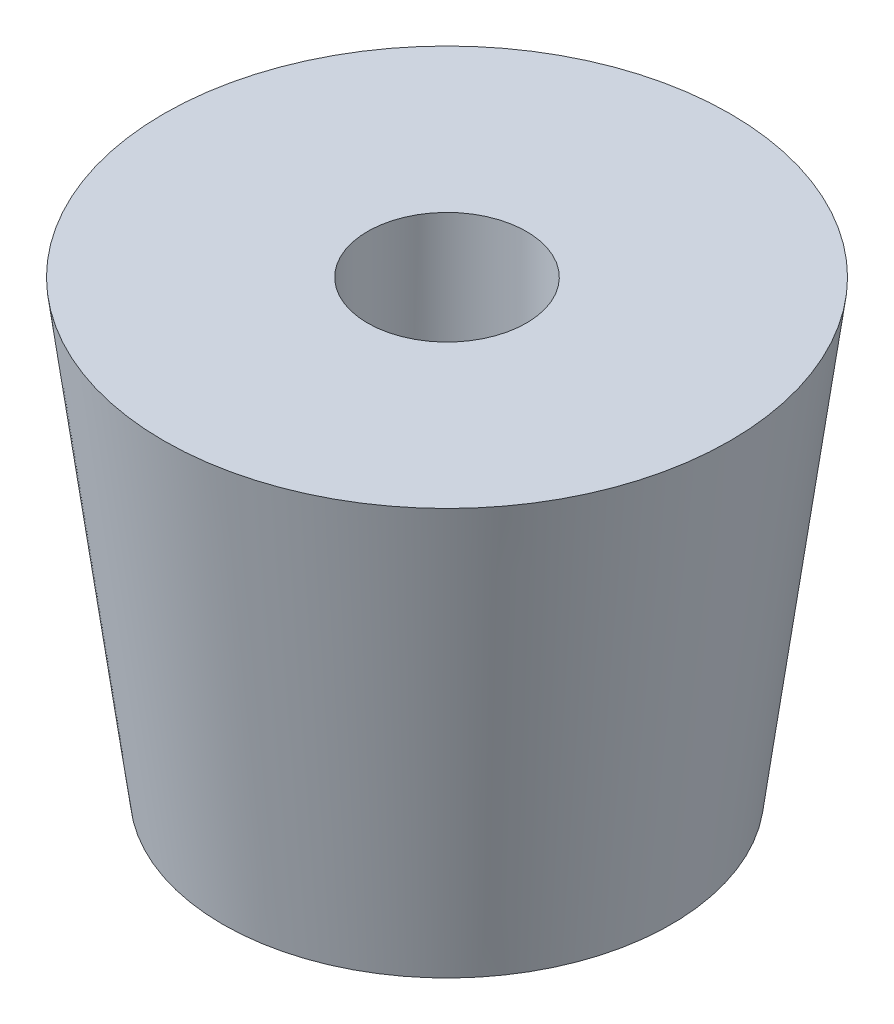
ISO-10303-21;
HEADER;
FILE_DESCRIPTION(('STEP AP214'),'2;1');
FILE_NAME('part.step','',(''),(''),'','','');
FILE_SCHEMA(('AUTOMOTIVE_DESIGN { 1 0 10303 214 1 1 1 1 }'));
ENDSEC;
DATA;
#1=APPLICATION_CONTEXT('core data for automotive mechanical design processes');
#2=APPLICATION_PROTOCOL_DEFINITION('international standard','automotive_design',2000,#1);
#3=PRODUCT_CONTEXT('',#1,'mechanical');
#4=PRODUCT('Part','Part','',(#3));
#5=PRODUCT_RELATED_PRODUCT_CATEGORY('part','',(#4));
#6=PRODUCT_DEFINITION_FORMATION('','',#4);
#7=PRODUCT_DEFINITION_CONTEXT('part definition',#1,'design');
#8=PRODUCT_DEFINITION('design','',#6,#7);
#9=PRODUCT_DEFINITION_SHAPE('','',#8);
#10=(LENGTH_UNIT() NAMED_UNIT(*) SI_UNIT(.MILLI.,.METRE.));
#11=(NAMED_UNIT(*) PLANE_ANGLE_UNIT() SI_UNIT($,.RADIAN.));
#12=(NAMED_UNIT(*) SI_UNIT($,.STERADIAN.) SOLID_ANGLE_UNIT());
#13=UNCERTAINTY_MEASURE_WITH_UNIT(LENGTH_MEASURE(1.E-05),#10,'distance_accuracy_value','');
#14=(GEOMETRIC_REPRESENTATION_CONTEXT(3) GLOBAL_UNCERTAINTY_ASSIGNED_CONTEXT((#13)) GLOBAL_UNIT_ASSIGNED_CONTEXT((#10,
#11,#12)) REPRESENTATION_CONTEXT('',''));
#15=CARTESIAN_POINT('',(0.,0.,0.));
#16=DIRECTION('',(0.,0.,1.));
#17=DIRECTION('',(1.,0.,0.));
#18=AXIS2_PLACEMENT_3D('',#15,#16,#17);
#19=CARTESIAN_POINT('',(0.,0.,0.));
#20=DIRECTION('',(0.,1.,0.));
#21=DIRECTION('',(0.,0.,1.));
#22=AXIS2_PLACEMENT_3D('',#19,#20,#21);
#23=CONICAL_SURFACE('',#22,6.35,0.130899693899575);
#24=CARTESIAN_POINT('',(0.,12.7,0.));
#25=DIRECTION('',(0.,1.,0.));
#26=DIRECTION('',(0.,0.,1.));
#27=AXIS2_PLACEMENT_3D('',#24,#25,#26);
#28=CIRCLE('',#27,8.02198671935993);
#29=CARTESIAN_POINT('',(0.,12.7,8.02198671935993));
#30=VERTEX_POINT('',#29);
#31=EDGE_CURVE('E10',#30,#30,#28,.T.);
#32=ORIENTED_EDGE('',*,*,#31,.F.);
#33=EDGE_LOOP('',(#32));
#34=FACE_BOUND('',#33,.T.);
#35=CARTESIAN_POINT('',(0.,0.,0.));
#36=DIRECTION('',(0.,1.,0.));
#37=DIRECTION('',(0.,0.,1.));
#38=AXIS2_PLACEMENT_3D('',#35,#36,#37);
#39=CIRCLE('',#38,6.35);
#40=CARTESIAN_POINT('',(0.,0.,6.35));
#41=VERTEX_POINT('',#40);
#42=EDGE_CURVE('E45',#41,#41,#39,.T.);
#43=ORIENTED_EDGE('',*,*,#42,.T.);
#44=EDGE_LOOP('',(#43));
#45=FACE_BOUND('',#44,.T.);
#46=ADVANCED_FACE('F37',(#34,#45),#23,.T.);
#47=CARTESIAN_POINT('',(0.,12.7,0.));
#48=DIRECTION('',(0.,1.,0.));
#49=DIRECTION('',(0.,0.,1.));
#50=AXIS2_PLACEMENT_3D('',#47,#48,#49);
#51=PLANE('',#50);
#52=CARTESIAN_POINT('',(0.,12.7,0.));
#53=DIRECTION('',(0.,1.,0.));
#54=DIRECTION('',(0.,0.,1.));
#55=AXIS2_PLACEMENT_3D('',#52,#53,#54);
#56=CIRCLE('',#55,2.25);
#57=CARTESIAN_POINT('',(0.,12.7,2.25));
#58=VERTEX_POINT('',#57);
#59=EDGE_CURVE('E60',#58,#58,#56,.T.);
#60=ORIENTED_EDGE('',*,*,#59,.F.);
#61=EDGE_LOOP('',(#60));
#62=FACE_BOUND('',#61,.T.);
#63=ORIENTED_EDGE('',*,*,#31,.T.);
#64=EDGE_LOOP('',(#63));
#65=FACE_BOUND('',#64,.T.);
#66=ADVANCED_FACE('F86',(#62,#65),#51,.T.);
#67=CARTESIAN_POINT('',(0.,0.,0.));
#68=DIRECTION('',(0.,1.,0.));
#69=DIRECTION('',(0.,0.,1.));
#70=AXIS2_PLACEMENT_3D('',#67,#68,#69);
#71=PLANE('',#70);
#72=CARTESIAN_POINT('',(0.,0.,0.));
#73=DIRECTION('',(0.,-1.,0.));
#74=DIRECTION('',(0.,0.,-1.));
#75=AXIS2_PLACEMENT_3D('',#72,#73,#74);
#76=CIRCLE('',#75,3.5);
#77=CARTESIAN_POINT('',(0.,0.,-3.5));
#78=VERTEX_POINT('',#77);
#79=EDGE_CURVE('E53',#78,#78,#76,.T.);
#80=ORIENTED_EDGE('',*,*,#79,.F.);
#81=EDGE_LOOP('',(#80));
#82=FACE_BOUND('',#81,.T.);
#83=ORIENTED_EDGE('',*,*,#42,.F.);
#84=EDGE_LOOP('',(#83));
#85=FACE_BOUND('',#84,.T.);
#86=ADVANCED_FACE('F80',(#82,#85),#71,.F.);
#87=CARTESIAN_POINT('',(0.,8.89,0.));
#88=DIRECTION('',(0.,-1.,0.));
#89=DIRECTION('',(0.,0.,-1.));
#90=AXIS2_PLACEMENT_3D('',#87,#88,#89);
#91=CYLINDRICAL_SURFACE('',#90,3.5);
#92=CARTESIAN_POINT('',(0.,8.89,0.));
#93=DIRECTION('',(0.,-1.,0.));
#94=DIRECTION('',(0.,0.,-1.));
#95=AXIS2_PLACEMENT_3D('',#92,#93,#94);
#96=CIRCLE('',#95,3.5);
#97=CARTESIAN_POINT('',(0.,8.89,-3.5));
#98=VERTEX_POINT('',#97);
#99=EDGE_CURVE('E50',#98,#98,#96,.T.);
#100=ORIENTED_EDGE('',*,*,#99,.F.);
#101=EDGE_LOOP('',(#100));
#102=FACE_BOUND('',#101,.T.);
#103=ORIENTED_EDGE('',*,*,#79,.T.);
#104=EDGE_LOOP('',(#103));
#105=FACE_BOUND('',#104,.T.);
#106=ADVANCED_FACE('F74',(#102,#105),#91,.F.);
#107=CARTESIAN_POINT('',(0.,8.89,0.));
#108=DIRECTION('',(0.,-1.,0.));
#109=DIRECTION('',(0.,0.,-1.));
#110=AXIS2_PLACEMENT_3D('',#107,#108,#109);
#111=PLANE('',#110);
#112=CARTESIAN_POINT('',(0.,8.89,0.));
#113=DIRECTION('',(0.,-1.,0.));
#114=DIRECTION('',(0.,0.,-1.));
#115=AXIS2_PLACEMENT_3D('',#112,#113,#114);
#116=CIRCLE('',#115,2.25);
#117=CARTESIAN_POINT('',(0.,8.89,-2.25));
#118=VERTEX_POINT('',#117);
#119=EDGE_CURVE('E40',#118,#118,#116,.T.);
#120=ORIENTED_EDGE('',*,*,#119,.F.);
#121=EDGE_LOOP('',(#120));
#122=FACE_BOUND('',#121,.T.);
#123=ORIENTED_EDGE('',*,*,#99,.T.);
#124=EDGE_LOOP('',(#123));
#125=FACE_BOUND('',#124,.T.);
#126=ADVANCED_FACE('F71',(#122,#125),#111,.T.);
#127=CARTESIAN_POINT('',(0.,0.,0.));
#128=DIRECTION('',(0.,1.,0.));
#129=DIRECTION('',(0.,0.,1.));
#130=AXIS2_PLACEMENT_3D('',#127,#128,#129);
#131=CYLINDRICAL_SURFACE('',#130,2.25);
#132=ORIENTED_EDGE('',*,*,#119,.T.);
#133=EDGE_LOOP('',(#132));
#134=FACE_BOUND('',#133,.T.);
#135=ORIENTED_EDGE('',*,*,#59,.T.);
#136=EDGE_LOOP('',(#135));
#137=FACE_BOUND('',#136,.T.);
#138=ADVANCED_FACE('F69',(#134,#137),#131,.F.);
#139=CLOSED_SHELL('',(#46,#66,#86,#106,#126,#138));
#140=MANIFOLD_SOLID_BREP('B2',#139);
#141=ADVANCED_BREP_SHAPE_REPRESENTATION('',(#18,#140),#14);
#142=SHAPE_DEFINITION_REPRESENTATION(#9,#141);
ENDSEC;
END-ISO-10303-21;
